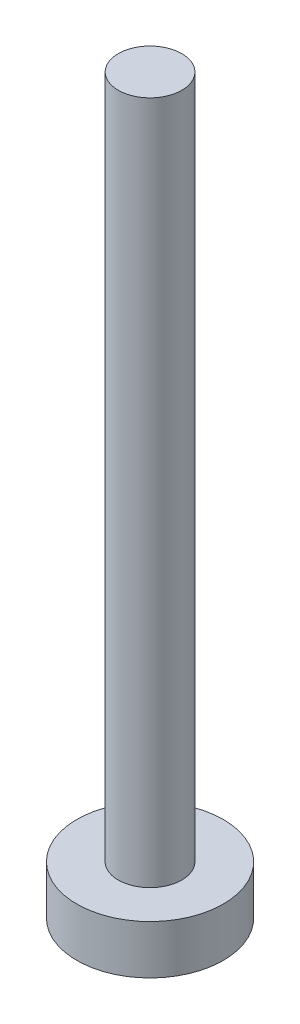
ISO-10303-21;
HEADER;
FILE_DESCRIPTION(('STEP AP214'),'2;1');
FILE_NAME('part.step','',(''),(''),'','','');
FILE_SCHEMA(('AUTOMOTIVE_DESIGN { 1 0 10303 214 1 1 1 1 }'));
ENDSEC;
DATA;
#1=APPLICATION_CONTEXT('core data for automotive mechanical design processes');
#2=APPLICATION_PROTOCOL_DEFINITION('international standard','automotive_design',2000,#1);
#3=PRODUCT_CONTEXT('',#1,'mechanical');
#4=PRODUCT('Part','Part','',(#3));
#5=PRODUCT_RELATED_PRODUCT_CATEGORY('part','',(#4));
#6=PRODUCT_DEFINITION_FORMATION('','',#4);
#7=PRODUCT_DEFINITION_CONTEXT('part definition',#1,'design');
#8=PRODUCT_DEFINITION('design','',#6,#7);
#9=PRODUCT_DEFINITION_SHAPE('','',#8);
#10=(LENGTH_UNIT() NAMED_UNIT(*) SI_UNIT(.MILLI.,.METRE.));
#11=(NAMED_UNIT(*) PLANE_ANGLE_UNIT() SI_UNIT($,.RADIAN.));
#12=(NAMED_UNIT(*) SI_UNIT($,.STERADIAN.) SOLID_ANGLE_UNIT());
#13=UNCERTAINTY_MEASURE_WITH_UNIT(LENGTH_MEASURE(1.E-05),#10,'distance_accuracy_value','');
#14=(GEOMETRIC_REPRESENTATION_CONTEXT(3) GLOBAL_UNCERTAINTY_ASSIGNED_CONTEXT((#13)) GLOBAL_UNIT_ASSIGNED_CONTEXT((#10,
#11,#12)) REPRESENTATION_CONTEXT('',''));
#15=CARTESIAN_POINT('',(0.,0.,0.));
#16=DIRECTION('',(0.,0.,1.));
#17=DIRECTION('',(1.,0.,0.));
#18=AXIS2_PLACEMENT_3D('',#15,#16,#17);
#19=CARTESIAN_POINT('',(0.,14.,0.));
#20=DIRECTION('',(0.,-1.,0.));
#21=DIRECTION('',(0.,0.,-1.));
#22=AXIS2_PLACEMENT_3D('',#19,#20,#21);
#23=CYLINDRICAL_SURFACE('',#22,0.65);
#24=CARTESIAN_POINT('',(0.,14.,0.));
#25=DIRECTION('',(0.,1.,0.));
#26=DIRECTION('',(0.,0.,1.));
#27=AXIS2_PLACEMENT_3D('',#24,#25,#26);
#28=CIRCLE('',#27,0.65);
#29=CARTESIAN_POINT('',(0.,14.,0.65));
#30=VERTEX_POINT('',#29);
#31=EDGE_CURVE('E10',#30,#30,#28,.T.);
#32=ORIENTED_EDGE('',*,*,#31,.F.);
#33=EDGE_LOOP('',(#32));
#34=FACE_BOUND('',#33,.T.);
#35=CARTESIAN_POINT('',(0.,0.,0.));
#36=DIRECTION('',(0.,1.,0.));
#37=DIRECTION('',(0.,0.,1.));
#38=AXIS2_PLACEMENT_3D('',#35,#36,#37);
#39=CIRCLE('',#38,0.65);
#40=CARTESIAN_POINT('',(0.,0.,0.65));
#41=VERTEX_POINT('',#40);
#42=EDGE_CURVE('E38',#41,#41,#39,.T.);
#43=ORIENTED_EDGE('',*,*,#42,.T.);
#44=EDGE_LOOP('',(#43));
#45=FACE_BOUND('',#44,.T.);
#46=ADVANCED_FACE('F35',(#34,#45),#23,.T.);
#47=CARTESIAN_POINT('',(0.,14.,0.));
#48=DIRECTION('',(0.,1.,0.));
#49=DIRECTION('',(0.,0.,1.));
#50=AXIS2_PLACEMENT_3D('',#47,#48,#49);
#51=PLANE('',#50);
#52=ORIENTED_EDGE('',*,*,#31,.T.);
#53=EDGE_LOOP('',(#52));
#54=FACE_BOUND('',#53,.T.);
#55=ADVANCED_FACE('F58',(#54),#51,.T.);
#56=CARTESIAN_POINT('',(0.,-1.,0.));
#57=DIRECTION('',(0.,1.,0.));
#58=DIRECTION('',(0.,0.,1.));
#59=AXIS2_PLACEMENT_3D('',#56,#57,#58);
#60=CYLINDRICAL_SURFACE('',#59,1.5);
#61=CARTESIAN_POINT('',(0.,-1.,0.));
#62=DIRECTION('',(0.,-1.,0.));
#63=DIRECTION('',(0.,0.,-1.));
#64=AXIS2_PLACEMENT_3D('',#61,#62,#63);
#65=CIRCLE('',#64,1.5);
#66=CARTESIAN_POINT('',(0.,-1.,-1.5));
#67=VERTEX_POINT('',#66);
#68=EDGE_CURVE('E45',#67,#67,#65,.T.);
#69=ORIENTED_EDGE('',*,*,#68,.F.);
#70=EDGE_LOOP('',(#69));
#71=FACE_BOUND('',#70,.T.);
#72=CARTESIAN_POINT('',(0.,0.,0.));
#73=DIRECTION('',(0.,-1.,0.));
#74=DIRECTION('',(0.,0.,-1.));
#75=AXIS2_PLACEMENT_3D('',#72,#73,#74);
#76=CIRCLE('',#75,1.5);
#77=CARTESIAN_POINT('',(0.,0.,-1.5));
#78=VERTEX_POINT('',#77);
#79=EDGE_CURVE('E47',#78,#78,#76,.T.);
#80=ORIENTED_EDGE('',*,*,#79,.T.);
#81=EDGE_LOOP('',(#80));
#82=FACE_BOUND('',#81,.T.);
#83=ADVANCED_FACE('F55',(#71,#82),#60,.T.);
#84=CARTESIAN_POINT('',(0.,-1.,0.));
#85=DIRECTION('',(0.,-1.,0.));
#86=DIRECTION('',(0.,0.,-1.));
#87=AXIS2_PLACEMENT_3D('',#84,#85,#86);
#88=PLANE('',#87);
#89=ORIENTED_EDGE('',*,*,#68,.T.);
#90=EDGE_LOOP('',(#89));
#91=FACE_BOUND('',#90,.T.);
#92=ADVANCED_FACE('F53',(#91),#88,.T.);
#93=CARTESIAN_POINT('',(0.,0.,0.));
#94=DIRECTION('',(0.,-1.,0.));
#95=DIRECTION('',(0.,0.,-1.));
#96=AXIS2_PLACEMENT_3D('',#93,#94,#95);
#97=PLANE('',#96);
#98=ORIENTED_EDGE('',*,*,#42,.F.);
#99=EDGE_LOOP('',(#98));
#100=FACE_BOUND('',#99,.T.);
#101=ORIENTED_EDGE('',*,*,#79,.F.);
#102=EDGE_LOOP('',(#101));
#103=FACE_BOUND('',#102,.T.);
#104=ADVANCED_FACE('F62',(#100,#103),#97,.F.);
#105=CLOSED_SHELL('',(#46,#55,#83,#92,#104));
#106=MANIFOLD_SOLID_BREP('B2',#105);
#107=ADVANCED_BREP_SHAPE_REPRESENTATION('',(#18,#106),#14);
#108=SHAPE_DEFINITION_REPRESENTATION(#9,#107);
ENDSEC;
END-ISO-10303-21;
